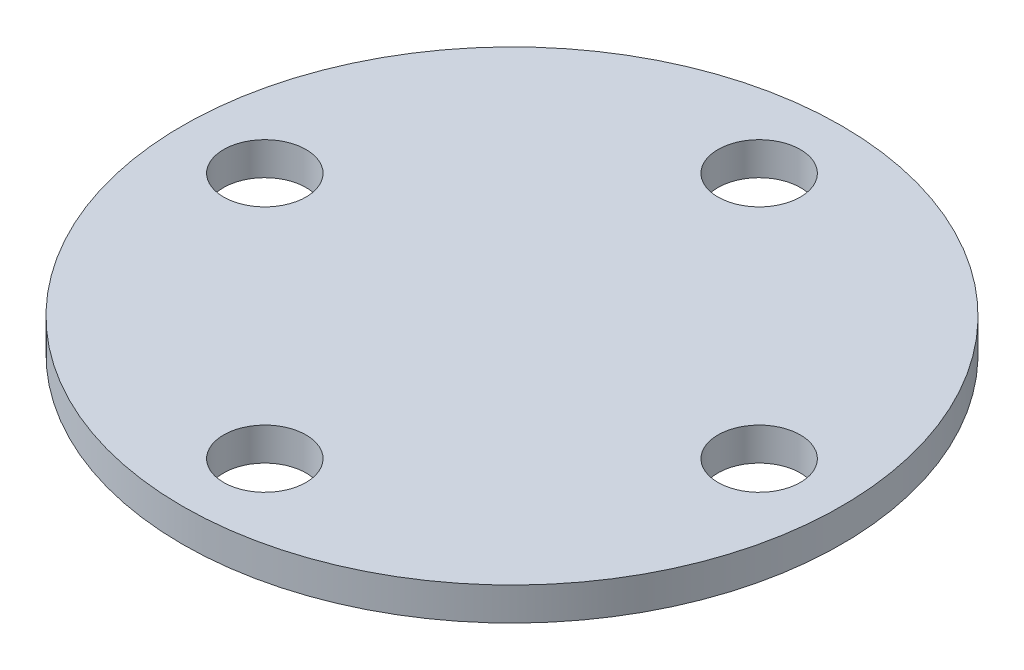
ISO-10303-21;
HEADER;
FILE_DESCRIPTION(('STEP AP214'),'2;1');
FILE_NAME('part.step','',(''),(''),'','','');
FILE_SCHEMA(('AUTOMOTIVE_DESIGN { 1 0 10303 214 1 1 1 1 }'));
ENDSEC;
DATA;
#1=APPLICATION_CONTEXT('core data for automotive mechanical design processes');
#2=APPLICATION_PROTOCOL_DEFINITION('international standard','automotive_design',2000,#1);
#3=PRODUCT_CONTEXT('',#1,'mechanical');
#4=PRODUCT('Part','Part','',(#3));
#5=PRODUCT_RELATED_PRODUCT_CATEGORY('part','',(#4));
#6=PRODUCT_DEFINITION_FORMATION('','',#4);
#7=PRODUCT_DEFINITION_CONTEXT('part definition',#1,'design');
#8=PRODUCT_DEFINITION('design','',#6,#7);
#9=PRODUCT_DEFINITION_SHAPE('','',#8);
#10=(LENGTH_UNIT() NAMED_UNIT(*) SI_UNIT(.MILLI.,.METRE.));
#11=(NAMED_UNIT(*) PLANE_ANGLE_UNIT() SI_UNIT($,.RADIAN.));
#12=(NAMED_UNIT(*) SI_UNIT($,.STERADIAN.) SOLID_ANGLE_UNIT());
#13=UNCERTAINTY_MEASURE_WITH_UNIT(LENGTH_MEASURE(1.E-05),#10,'distance_accuracy_value','');
#14=(GEOMETRIC_REPRESENTATION_CONTEXT(3) GLOBAL_UNCERTAINTY_ASSIGNED_CONTEXT((#13)) GLOBAL_UNIT_ASSIGNED_CONTEXT((#10,
#11,#12)) REPRESENTATION_CONTEXT('',''));
#15=CARTESIAN_POINT('',(0.,0.,0.));
#16=DIRECTION('',(0.,0.,1.));
#17=DIRECTION('',(1.,0.,0.));
#18=AXIS2_PLACEMENT_3D('',#15,#16,#17);
#19=CARTESIAN_POINT('',(0.,2.54,0.));
#20=DIRECTION('',(0.,1.,0.));
#21=DIRECTION('',(0.,0.,1.));
#22=AXIS2_PLACEMENT_3D('',#19,#20,#21);
#23=PLANE('',#22);
#24=CARTESIAN_POINT('',(2.70250191894123E-12,2.54,19.05));
#25=DIRECTION('',(0.,1.,0.));
#26=DIRECTION('',(0.,0.,1.));
#27=AXIS2_PLACEMENT_3D('',#24,#25,#26);
#28=CIRCLE('',#27,3.17500000000271);
#29=CARTESIAN_POINT('',(2.70250191894123E-12,2.54,22.2250000000027));
#30=VERTEX_POINT('',#29);
#31=EDGE_CURVE('E53',#30,#30,#28,.T.);
#32=ORIENTED_EDGE('',*,*,#31,.F.);
#33=EDGE_LOOP('',(#32));
#34=FACE_BOUND('',#33,.T.);
#35=CARTESIAN_POINT('',(0.,2.54,-19.05));
#36=DIRECTION('',(0.,1.,0.));
#37=DIRECTION('',(0.,0.,1.));
#38=AXIS2_PLACEMENT_3D('',#35,#36,#37);
#39=CIRCLE('',#38,3.175);
#40=CARTESIAN_POINT('',(0.,2.54,-15.875));
#41=VERTEX_POINT('',#40);
#42=EDGE_CURVE('E42',#41,#41,#39,.T.);
#43=ORIENTED_EDGE('',*,*,#42,.F.);
#44=EDGE_LOOP('',(#43));
#45=FACE_BOUND('',#44,.T.);
#46=CARTESIAN_POINT('',(0.,2.54,0.));
#47=DIRECTION('',(0.,1.,0.));
#48=DIRECTION('',(0.,0.,1.));
#49=AXIS2_PLACEMENT_3D('',#46,#47,#48);
#50=CIRCLE('',#49,25.4);
#51=CARTESIAN_POINT('',(0.,2.54,25.4));
#52=VERTEX_POINT('',#51);
#53=EDGE_CURVE('E10',#52,#52,#50,.T.);
#54=ORIENTED_EDGE('',*,*,#53,.T.);
#55=EDGE_LOOP('',(#54));
#56=FACE_BOUND('',#55,.T.);
#57=CARTESIAN_POINT('',(19.0500000000014,2.54,-1.35125095947062E-12));
#58=DIRECTION('',(0.,1.,0.));
#59=DIRECTION('',(0.,0.,1.));
#60=AXIS2_PLACEMENT_3D('',#57,#58,#59);
#61=CIRCLE('',#60,3.17500000000096);
#62=CARTESIAN_POINT('',(19.0500000000014,2.54,3.17499999999961));
#63=VERTEX_POINT('',#62);
#64=EDGE_CURVE('E47',#63,#63,#61,.T.);
#65=ORIENTED_EDGE('',*,*,#64,.F.);
#66=EDGE_LOOP('',(#65));
#67=FACE_BOUND('',#66,.T.);
#68=CARTESIAN_POINT('',(-19.0499999999987,2.54,1.35358391162299E-12));
#69=DIRECTION('',(0.,1.,0.));
#70=DIRECTION('',(0.,0.,1.));
#71=AXIS2_PLACEMENT_3D('',#68,#69,#70);
#72=CIRCLE('',#71,3.17500000000188);
#73=CARTESIAN_POINT('',(-19.0499999999987,2.54,3.17500000000323));
#74=VERTEX_POINT('',#73);
#75=EDGE_CURVE('E59',#74,#74,#72,.T.);
#76=ORIENTED_EDGE('',*,*,#75,.F.);
#77=EDGE_LOOP('',(#76));
#78=FACE_BOUND('',#77,.T.);
#79=ADVANCED_FACE('F31',(#34,#45,#56,#67,#78),#23,.T.);
#80=CARTESIAN_POINT('',(0.,0.,0.));
#81=DIRECTION('',(0.,1.,0.));
#82=DIRECTION('',(0.,0.,1.));
#83=AXIS2_PLACEMENT_3D('',#80,#81,#82);
#84=PLANE('',#83);
#85=CARTESIAN_POINT('',(0.,0.,0.));
#86=DIRECTION('',(0.,1.,0.));
#87=DIRECTION('',(0.,0.,1.));
#88=AXIS2_PLACEMENT_3D('',#85,#86,#87);
#89=CIRCLE('',#88,25.4);
#90=CARTESIAN_POINT('',(0.,0.,25.4));
#91=VERTEX_POINT('',#90);
#92=EDGE_CURVE('E35',#91,#91,#89,.T.);
#93=ORIENTED_EDGE('',*,*,#92,.F.);
#94=EDGE_LOOP('',(#93));
#95=FACE_BOUND('',#94,.T.);
#96=CARTESIAN_POINT('',(0.,0.,-19.05));
#97=DIRECTION('',(0.,1.,0.));
#98=DIRECTION('',(0.,0.,1.));
#99=AXIS2_PLACEMENT_3D('',#96,#97,#98);
#100=CIRCLE('',#99,3.175);
#101=CARTESIAN_POINT('',(0.,0.,-15.875));
#102=VERTEX_POINT('',#101);
#103=EDGE_CURVE('E44',#102,#102,#100,.T.);
#104=ORIENTED_EDGE('',*,*,#103,.T.);
#105=EDGE_LOOP('',(#104));
#106=FACE_BOUND('',#105,.T.);
#107=CARTESIAN_POINT('',(19.0500000000014,0.,-1.35125095947062E-12));
#108=DIRECTION('',(0.,1.,0.));
#109=DIRECTION('',(0.,0.,1.));
#110=AXIS2_PLACEMENT_3D('',#107,#108,#109);
#111=CIRCLE('',#110,3.17500000000096);
#112=CARTESIAN_POINT('',(19.0500000000014,0.,3.17499999999961));
#113=VERTEX_POINT('',#112);
#114=EDGE_CURVE('E50',#113,#113,#111,.T.);
#115=ORIENTED_EDGE('',*,*,#114,.T.);
#116=EDGE_LOOP('',(#115));
#117=FACE_BOUND('',#116,.T.);
#118=CARTESIAN_POINT('',(2.70250191894123E-12,0.,19.05));
#119=DIRECTION('',(0.,1.,0.));
#120=DIRECTION('',(0.,0.,1.));
#121=AXIS2_PLACEMENT_3D('',#118,#119,#120);
#122=CIRCLE('',#121,3.17500000000271);
#123=CARTESIAN_POINT('',(2.70250191894123E-12,0.,22.2250000000027));
#124=VERTEX_POINT('',#123);
#125=EDGE_CURVE('E56',#124,#124,#122,.T.);
#126=ORIENTED_EDGE('',*,*,#125,.T.);
#127=EDGE_LOOP('',(#126));
#128=FACE_BOUND('',#127,.T.);
#129=CARTESIAN_POINT('',(-19.0499999999987,0.,1.35358391162299E-12));
#130=DIRECTION('',(0.,1.,0.));
#131=DIRECTION('',(0.,0.,1.));
#132=AXIS2_PLACEMENT_3D('',#129,#130,#131);
#133=CIRCLE('',#132,3.17500000000188);
#134=CARTESIAN_POINT('',(-19.0499999999987,0.,3.17500000000323));
#135=VERTEX_POINT('',#134);
#136=EDGE_CURVE('E62',#135,#135,#133,.T.);
#137=ORIENTED_EDGE('',*,*,#136,.T.);
#138=EDGE_LOOP('',(#137));
#139=FACE_BOUND('',#138,.T.);
#140=ADVANCED_FACE('F72',(#95,#106,#117,#128,#139),#84,.F.);
#141=CARTESIAN_POINT('',(0.,2.54,0.));
#142=DIRECTION('',(0.,-1.,0.));
#143=DIRECTION('',(0.,0.,-1.));
#144=AXIS2_PLACEMENT_3D('',#141,#142,#143);
#145=CYLINDRICAL_SURFACE('',#144,25.4);
#146=ORIENTED_EDGE('',*,*,#53,.F.);
#147=EDGE_LOOP('',(#146));
#148=FACE_BOUND('',#147,.T.);
#149=ORIENTED_EDGE('',*,*,#92,.T.);
#150=EDGE_LOOP('',(#149));
#151=FACE_BOUND('',#150,.T.);
#152=ADVANCED_FACE('F33',(#148,#151),#145,.T.);
#153=CARTESIAN_POINT('',(0.,2.54,-19.05));
#154=DIRECTION('',(0.,-1.,0.));
#155=DIRECTION('',(0.,0.,-1.));
#156=AXIS2_PLACEMENT_3D('',#153,#154,#155);
#157=CYLINDRICAL_SURFACE('',#156,3.175);
#158=ORIENTED_EDGE('',*,*,#42,.T.);
#159=EDGE_LOOP('',(#158));
#160=FACE_BOUND('',#159,.T.);
#161=ORIENTED_EDGE('',*,*,#103,.F.);
#162=EDGE_LOOP('',(#161));
#163=FACE_BOUND('',#162,.T.);
#164=ADVANCED_FACE('F82',(#160,#163),#157,.F.);
#165=CARTESIAN_POINT('',(19.0500000000014,2.54,-1.35125095947062E-12));
#166=DIRECTION('',(0.,-1.,0.));
#167=DIRECTION('',(0.,0.,-1.));
#168=AXIS2_PLACEMENT_3D('',#165,#166,#167);
#169=CYLINDRICAL_SURFACE('',#168,3.17500000000096);
#170=ORIENTED_EDGE('',*,*,#64,.T.);
#171=EDGE_LOOP('',(#170));
#172=FACE_BOUND('',#171,.T.);
#173=ORIENTED_EDGE('',*,*,#114,.F.);
#174=EDGE_LOOP('',(#173));
#175=FACE_BOUND('',#174,.T.);
#176=ADVANCED_FACE('F85',(#172,#175),#169,.F.);
#177=CARTESIAN_POINT('',(2.70250191894123E-12,2.54,19.05));
#178=DIRECTION('',(0.,-1.,0.));
#179=DIRECTION('',(0.,0.,-1.));
#180=AXIS2_PLACEMENT_3D('',#177,#178,#179);
#181=CYLINDRICAL_SURFACE('',#180,3.17500000000271);
#182=ORIENTED_EDGE('',*,*,#31,.T.);
#183=EDGE_LOOP('',(#182));
#184=FACE_BOUND('',#183,.T.);
#185=ORIENTED_EDGE('',*,*,#125,.F.);
#186=EDGE_LOOP('',(#185));
#187=FACE_BOUND('',#186,.T.);
#188=ADVANCED_FACE('F89',(#184,#187),#181,.F.);
#189=CARTESIAN_POINT('',(-19.0499999999987,2.54,1.35358391162299E-12));
#190=DIRECTION('',(0.,-1.,0.));
#191=DIRECTION('',(0.,0.,-1.));
#192=AXIS2_PLACEMENT_3D('',#189,#190,#191);
#193=CYLINDRICAL_SURFACE('',#192,3.17500000000188);
#194=ORIENTED_EDGE('',*,*,#75,.T.);
#195=EDGE_LOOP('',(#194));
#196=FACE_BOUND('',#195,.T.);
#197=ORIENTED_EDGE('',*,*,#136,.F.);
#198=EDGE_LOOP('',(#197));
#199=FACE_BOUND('',#198,.T.);
#200=ADVANCED_FACE('F68',(#196,#199),#193,.F.);
#201=CLOSED_SHELL('',(#79,#140,#152,#164,#176,#188,#200));
#202=MANIFOLD_SOLID_BREP('B2',#201);
#203=ADVANCED_BREP_SHAPE_REPRESENTATION('',(#18,#202),#14);
#204=SHAPE_DEFINITION_REPRESENTATION(#9,#203);
ENDSEC;
END-ISO-10303-21;
